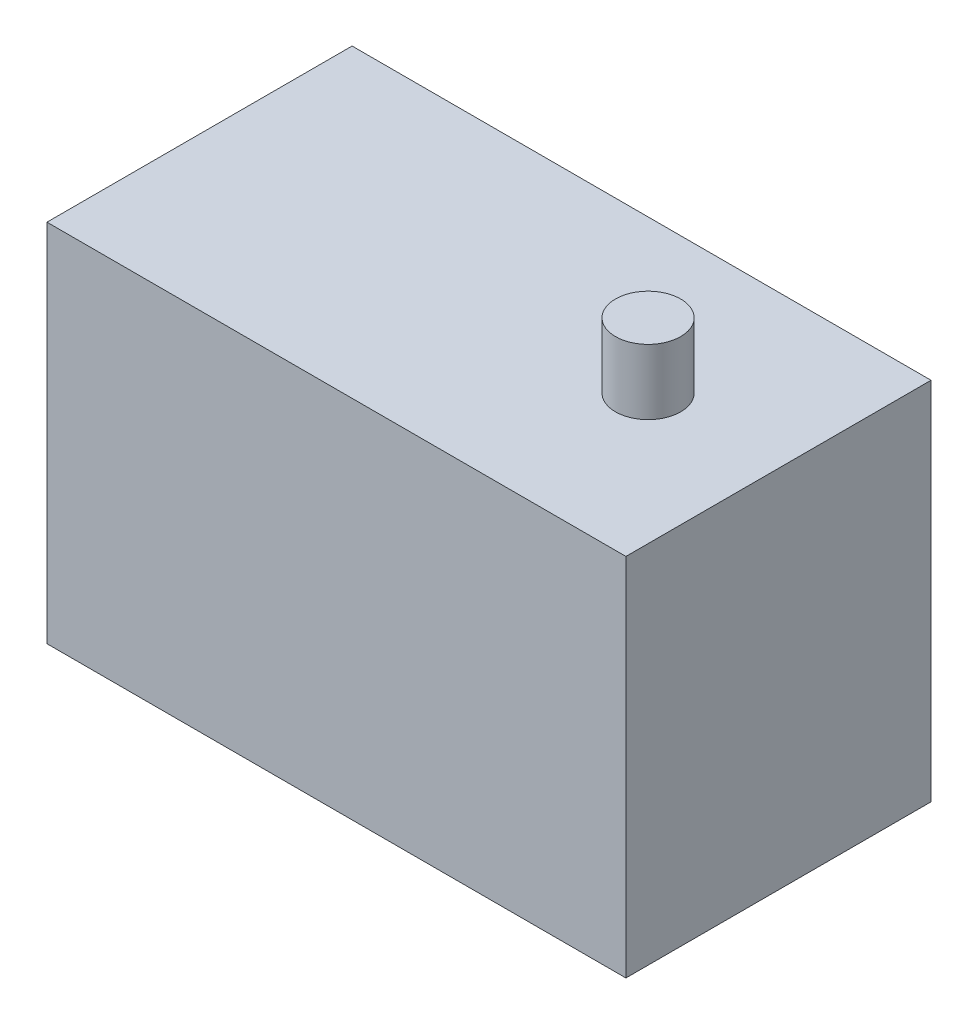
ISO-10303-21;
HEADER;
FILE_DESCRIPTION(('STEP AP214'),'2;1');
FILE_NAME('part.step','',(''),(''),'','','');
FILE_SCHEMA(('AUTOMOTIVE_DESIGN { 1 0 10303 214 1 1 1 1 }'));
ENDSEC;
DATA;
#1=APPLICATION_CONTEXT('core data for automotive mechanical design processes');
#2=APPLICATION_PROTOCOL_DEFINITION('international standard','automotive_design',2000,#1);
#3=PRODUCT_CONTEXT('',#1,'mechanical');
#4=PRODUCT('Part','Part','',(#3));
#5=PRODUCT_RELATED_PRODUCT_CATEGORY('part','',(#4));
#6=PRODUCT_DEFINITION_FORMATION('','',#4);
#7=PRODUCT_DEFINITION_CONTEXT('part definition',#1,'design');
#8=PRODUCT_DEFINITION('design','',#6,#7);
#9=PRODUCT_DEFINITION_SHAPE('','',#8);
#10=(LENGTH_UNIT() NAMED_UNIT(*) SI_UNIT(.MILLI.,.METRE.));
#11=(NAMED_UNIT(*) PLANE_ANGLE_UNIT() SI_UNIT($,.RADIAN.));
#12=(NAMED_UNIT(*) SI_UNIT($,.STERADIAN.) SOLID_ANGLE_UNIT());
#13=UNCERTAINTY_MEASURE_WITH_UNIT(LENGTH_MEASURE(1.E-05),#10,'distance_accuracy_value','');
#14=(GEOMETRIC_REPRESENTATION_CONTEXT(3) GLOBAL_UNCERTAINTY_ASSIGNED_CONTEXT((#13)) GLOBAL_UNIT_ASSIGNED_CONTEXT((#10,
#11,#12)) REPRESENTATION_CONTEXT('',''));
#15=CARTESIAN_POINT('',(0.,0.,0.));
#16=DIRECTION('',(0.,0.,1.));
#17=DIRECTION('',(1.,0.,0.));
#18=AXIS2_PLACEMENT_3D('',#15,#16,#17);
#19=CARTESIAN_POINT('',(-42.1477832512315,28.,-23.1931034482759));
#20=DIRECTION('',(1.,0.,0.));
#21=DIRECTION('',(0.,0.,-1.));
#22=AXIS2_PLACEMENT_3D('',#19,#20,#21);
#23=PLANE('',#22);
#24=DIRECTION('',(0.,0.,1.));
#25=VECTOR('',#24,1.);
#26=CARTESIAN_POINT('',(-42.1477832512315,0.,-23.1931034482759));
#27=LINE('',#26,#25);
#28=CARTESIAN_POINT('',(-42.1477832512315,0.,-23.1931034482759));
#29=VERTEX_POINT('',#28);
#30=CARTESIAN_POINT('',(-42.1477832512315,0.,0.20689655172414));
#31=VERTEX_POINT('',#30);
#32=EDGE_CURVE('E110',#29,#31,#27,.T.);
#33=ORIENTED_EDGE('',*,*,#32,.T.);
#34=DIRECTION('',(0.,-1.,0.));
#35=VECTOR('',#34,1.);
#36=CARTESIAN_POINT('',(-42.1477832512315,28.,0.20689655172414));
#37=LINE('',#36,#35);
#38=CARTESIAN_POINT('',(-42.1477832512315,28.,0.20689655172414));
#39=VERTEX_POINT('',#38);
#40=EDGE_CURVE('E48',#39,#31,#37,.T.);
#41=ORIENTED_EDGE('',*,*,#40,.F.);
#42=DIRECTION('',(0.,0.,1.));
#43=VECTOR('',#42,1.);
#44=CARTESIAN_POINT('',(-42.1477832512315,28.,-23.1931034482759));
#45=LINE('',#44,#43);
#46=CARTESIAN_POINT('',(-42.1477832512315,28.,-23.1931034482759));
#47=VERTEX_POINT('',#46);
#48=EDGE_CURVE('E92',#47,#39,#45,.T.);
#49=ORIENTED_EDGE('',*,*,#48,.F.);
#50=DIRECTION('',(0.,-1.,0.));
#51=VECTOR('',#50,1.);
#52=CARTESIAN_POINT('',(-42.1477832512315,28.,-23.1931034482759));
#53=LINE('',#52,#51);
#54=EDGE_CURVE('E106',#47,#29,#53,.T.);
#55=ORIENTED_EDGE('',*,*,#54,.T.);
#56=EDGE_LOOP('',(#33,#41,#49,#55));
#57=FACE_BOUND('',#56,.T.);
#58=ADVANCED_FACE('F39',(#57),#23,.F.);
#59=CARTESIAN_POINT('',(-42.1477832512315,28.,0.20689655172414));
#60=DIRECTION('',(0.,0.,-1.));
#61=DIRECTION('',(-1.,0.,0.));
#62=AXIS2_PLACEMENT_3D('',#59,#60,#61);
#63=PLANE('',#62);
#64=DIRECTION('',(1.,0.,0.));
#65=VECTOR('',#64,1.);
#66=CARTESIAN_POINT('',(-42.1477832512315,0.,0.20689655172414));
#67=LINE('',#66,#65);
#68=CARTESIAN_POINT('',(2.25221674876847,0.,0.20689655172414));
#69=VERTEX_POINT('',#68);
#70=EDGE_CURVE('E98',#31,#69,#67,.T.);
#71=ORIENTED_EDGE('',*,*,#70,.T.);
#72=DIRECTION('',(0.,-1.,0.));
#73=VECTOR('',#72,1.);
#74=CARTESIAN_POINT('',(2.25221674876847,28.,0.20689655172414));
#75=LINE('',#74,#73);
#76=CARTESIAN_POINT('',(2.25221674876847,28.,0.20689655172414));
#77=VERTEX_POINT('',#76);
#78=EDGE_CURVE('E96',#77,#69,#75,.T.);
#79=ORIENTED_EDGE('',*,*,#78,.F.);
#80=DIRECTION('',(1.,0.,0.));
#81=VECTOR('',#80,1.);
#82=CARTESIAN_POINT('',(-42.1477832512315,28.,0.20689655172414));
#83=LINE('',#82,#81);
#84=EDGE_CURVE('E87',#39,#77,#83,.T.);
#85=ORIENTED_EDGE('',*,*,#84,.F.);
#86=ORIENTED_EDGE('',*,*,#40,.T.);
#87=EDGE_LOOP('',(#71,#79,#85,#86));
#88=FACE_BOUND('',#87,.T.);
#89=ADVANCED_FACE('F97',(#88),#63,.F.);
#90=CARTESIAN_POINT('',(2.25221674876847,28.,-23.1931034482759));
#91=DIRECTION('',(-1.,0.,0.));
#92=DIRECTION('',(0.,0.,1.));
#93=AXIS2_PLACEMENT_3D('',#90,#91,#92);
#94=PLANE('',#93);
#95=DIRECTION('',(0.,0.,-1.));
#96=VECTOR('',#95,1.);
#97=CARTESIAN_POINT('',(2.25221674876847,0.,-23.1931034482759));
#98=LINE('',#97,#96);
#99=CARTESIAN_POINT('',(2.25221674876847,0.,-23.1931034482759));
#100=VERTEX_POINT('',#99);
#101=EDGE_CURVE('E73',#69,#100,#98,.T.);
#102=ORIENTED_EDGE('',*,*,#101,.T.);
#103=DIRECTION('',(0.,-1.,0.));
#104=VECTOR('',#103,1.);
#105=CARTESIAN_POINT('',(2.25221674876847,28.,-23.1931034482759));
#106=LINE('',#105,#104);
#107=CARTESIAN_POINT('',(2.25221674876847,28.,-23.1931034482759));
#108=VERTEX_POINT('',#107);
#109=EDGE_CURVE('E100',#108,#100,#106,.T.);
#110=ORIENTED_EDGE('',*,*,#109,.F.);
#111=DIRECTION('',(0.,0.,-1.));
#112=VECTOR('',#111,1.);
#113=CARTESIAN_POINT('',(2.25221674876847,28.,-23.1931034482759));
#114=LINE('',#113,#112);
#115=EDGE_CURVE('E90',#77,#108,#114,.T.);
#116=ORIENTED_EDGE('',*,*,#115,.F.);
#117=ORIENTED_EDGE('',*,*,#78,.T.);
#118=EDGE_LOOP('',(#102,#110,#116,#117));
#119=FACE_BOUND('',#118,.T.);
#120=ADVANCED_FACE('F102',(#119),#94,.F.);
#121=CARTESIAN_POINT('',(-42.1477832512315,28.,-23.1931034482759));
#122=DIRECTION('',(0.,0.,1.));
#123=DIRECTION('',(1.,0.,0.));
#124=AXIS2_PLACEMENT_3D('',#121,#122,#123);
#125=PLANE('',#124);
#126=DIRECTION('',(-1.,0.,0.));
#127=VECTOR('',#126,1.);
#128=CARTESIAN_POINT('',(-42.1477832512315,0.,-23.1931034482759));
#129=LINE('',#128,#127);
#130=EDGE_CURVE('E79',#100,#29,#129,.T.);
#131=ORIENTED_EDGE('',*,*,#130,.T.);
#132=ORIENTED_EDGE('',*,*,#54,.F.);
#133=DIRECTION('',(-1.,0.,0.));
#134=VECTOR('',#133,1.);
#135=CARTESIAN_POINT('',(-42.1477832512315,28.,-23.1931034482759));
#136=LINE('',#135,#134);
#137=EDGE_CURVE('E56',#108,#47,#136,.T.);
#138=ORIENTED_EDGE('',*,*,#137,.F.);
#139=ORIENTED_EDGE('',*,*,#109,.T.);
#140=EDGE_LOOP('',(#131,#132,#138,#139));
#141=FACE_BOUND('',#140,.T.);
#142=ADVANCED_FACE('F140',(#141),#125,.F.);
#143=CARTESIAN_POINT('',(0.,28.,0.));
#144=DIRECTION('',(0.,1.,0.));
#145=DIRECTION('',(0.,0.,1.));
#146=AXIS2_PLACEMENT_3D('',#143,#144,#145);
#147=PLANE('',#146);
#148=CARTESIAN_POINT('',(-7.74778325123153,28.,-11.4931034482759));
#149=DIRECTION('',(0.,1.,0.));
#150=DIRECTION('',(0.,0.,1.));
#151=AXIS2_PLACEMENT_3D('',#148,#149,#150);
#152=CIRCLE('',#151,2.5);
#153=CARTESIAN_POINT('',(-7.74778325123153,28.,-8.99310344827585));
#154=VERTEX_POINT('',#153);
#155=EDGE_CURVE('E11',#154,#154,#152,.T.);
#156=ORIENTED_EDGE('',*,*,#155,.F.);
#157=EDGE_LOOP('',(#156));
#158=FACE_BOUND('',#157,.T.);
#159=ORIENTED_EDGE('',*,*,#48,.T.);
#160=ORIENTED_EDGE('',*,*,#84,.T.);
#161=ORIENTED_EDGE('',*,*,#115,.T.);
#162=ORIENTED_EDGE('',*,*,#137,.T.);
#163=EDGE_LOOP('',(#159,#160,#161,#162));
#164=FACE_BOUND('',#163,.T.);
#165=ADVANCED_FACE('F88',(#158,#164),#147,.T.);
#166=CARTESIAN_POINT('',(0.,0.,0.));
#167=DIRECTION('',(0.,1.,0.));
#168=DIRECTION('',(0.,0.,1.));
#169=AXIS2_PLACEMENT_3D('',#166,#167,#168);
#170=PLANE('',#169);
#171=CARTESIAN_POINT('',(-7.74778325123153,0.,-11.4931034482759));
#172=DIRECTION('',(0.,1.,0.));
#173=DIRECTION('',(0.,0.,1.));
#174=AXIS2_PLACEMENT_3D('',#171,#172,#173);
#175=CIRCLE('',#174,2.5);
#176=CARTESIAN_POINT('',(-7.74778325123153,0.,-8.99310344827585));
#177=VERTEX_POINT('',#176);
#178=EDGE_CURVE('E199',#177,#177,#175,.T.);
#179=ORIENTED_EDGE('',*,*,#178,.T.);
#180=EDGE_LOOP('',(#179));
#181=FACE_BOUND('',#180,.T.);
#182=ORIENTED_EDGE('',*,*,#32,.F.);
#183=ORIENTED_EDGE('',*,*,#130,.F.);
#184=ORIENTED_EDGE('',*,*,#101,.F.);
#185=ORIENTED_EDGE('',*,*,#70,.F.);
#186=EDGE_LOOP('',(#182,#183,#184,#185));
#187=FACE_BOUND('',#186,.T.);
#188=ADVANCED_FACE('F128',(#181,#187),#170,.F.);
#189=CARTESIAN_POINT('',(-7.74778325123153,-5.,-11.4931034482759));
#190=DIRECTION('',(0.,1.,0.));
#191=DIRECTION('',(0.,0.,1.));
#192=AXIS2_PLACEMENT_3D('',#189,#190,#191);
#193=CYLINDRICAL_SURFACE('',#192,2.5);
#194=CARTESIAN_POINT('',(-7.74778325123153,-5.,-11.4931034482759));
#195=DIRECTION('',(0.,1.,0.));
#196=DIRECTION('',(0.,0.,1.));
#197=AXIS2_PLACEMENT_3D('',#194,#195,#196);
#198=CIRCLE('',#197,2.5);
#199=CARTESIAN_POINT('',(-7.74778325123153,-5.,-8.99310344827585));
#200=VERTEX_POINT('',#199);
#201=EDGE_CURVE('E114',#200,#200,#198,.T.);
#202=ORIENTED_EDGE('',*,*,#201,.T.);
#203=EDGE_LOOP('',(#202));
#204=FACE_BOUND('',#203,.T.);
#205=ORIENTED_EDGE('',*,*,#178,.F.);
#206=EDGE_LOOP('',(#205));
#207=FACE_BOUND('',#206,.T.);
#208=ADVANCED_FACE('F130',(#204,#207),#193,.T.);
#209=CARTESIAN_POINT('',(-7.74778325123153,-5.,-11.4931034482759));
#210=DIRECTION('',(0.,1.,0.));
#211=DIRECTION('',(0.,0.,1.));
#212=AXIS2_PLACEMENT_3D('',#209,#210,#211);
#213=PLANE('',#212);
#214=ORIENTED_EDGE('',*,*,#201,.F.);
#215=EDGE_LOOP('',(#214));
#216=FACE_BOUND('',#215,.T.);
#217=ADVANCED_FACE('F137',(#216),#213,.F.);
#218=CARTESIAN_POINT('',(-7.74778325123153,28.,-11.4931034482759));
#219=DIRECTION('',(0.,1.,0.));
#220=DIRECTION('',(0.,0.,1.));
#221=AXIS2_PLACEMENT_3D('',#218,#219,#220);
#222=CYLINDRICAL_SURFACE('',#221,2.5);
#223=ORIENTED_EDGE('',*,*,#155,.T.);
#224=EDGE_LOOP('',(#223));
#225=FACE_BOUND('',#224,.T.);
#226=CARTESIAN_POINT('',(-7.74778325123153,33.,-11.4931034482759));
#227=DIRECTION('',(0.,1.,0.));
#228=DIRECTION('',(0.,0.,1.));
#229=AXIS2_PLACEMENT_3D('',#226,#227,#228);
#230=CIRCLE('',#229,2.5);
#231=CARTESIAN_POINT('',(-7.74778325123153,33.,-8.99310344827585));
#232=VERTEX_POINT('',#231);
#233=EDGE_CURVE('E202',#232,#232,#230,.T.);
#234=ORIENTED_EDGE('',*,*,#233,.F.);
#235=EDGE_LOOP('',(#234));
#236=FACE_BOUND('',#235,.T.);
#237=ADVANCED_FACE('F173',(#225,#236),#222,.T.);
#238=CARTESIAN_POINT('',(-7.74778325123153,33.,-11.4931034482759));
#239=DIRECTION('',(0.,1.,0.));
#240=DIRECTION('',(0.,0.,1.));
#241=AXIS2_PLACEMENT_3D('',#238,#239,#240);
#242=PLANE('',#241);
#243=ORIENTED_EDGE('',*,*,#233,.T.);
#244=EDGE_LOOP('',(#243));
#245=FACE_BOUND('',#244,.T.);
#246=ADVANCED_FACE('F178',(#245),#242,.T.);
#247=CLOSED_SHELL('',(#58,#89,#120,#142,#165,#188,#208,#217,#237,#246));
#248=MANIFOLD_SOLID_BREP('B2',#247);
#249=ADVANCED_BREP_SHAPE_REPRESENTATION('',(#18,#248),#14);
#250=SHAPE_DEFINITION_REPRESENTATION(#9,#249);
ENDSEC;
END-ISO-10303-21;
